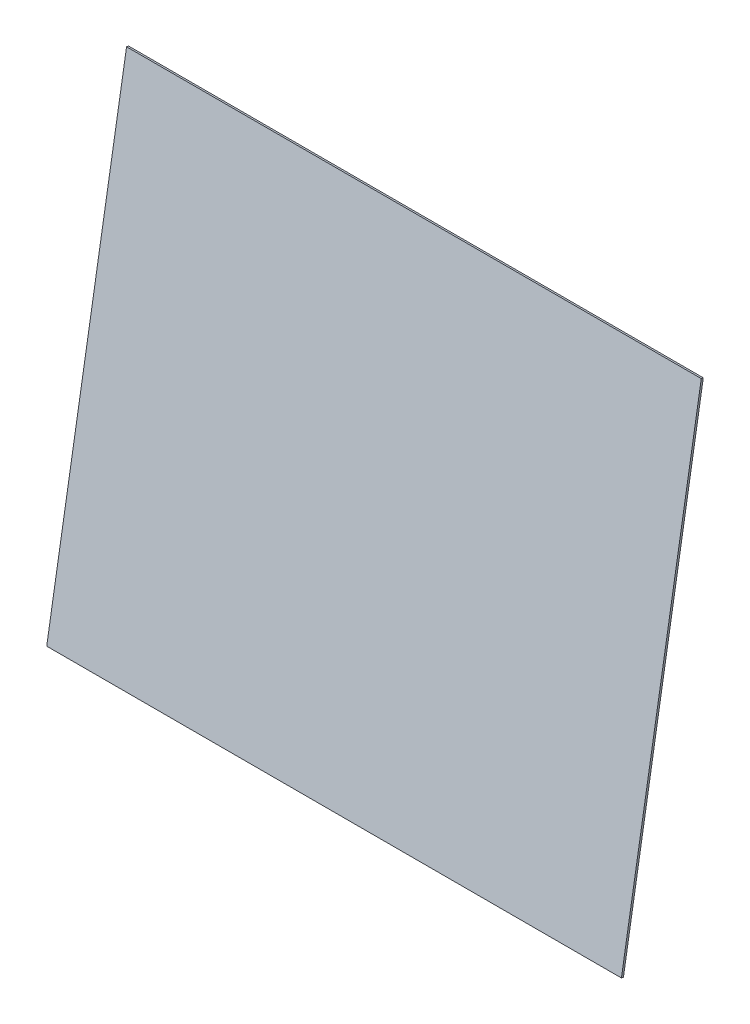
ISO-10303-21;
HEADER;
FILE_DESCRIPTION(('STEP AP214'),'2;1');
FILE_NAME('part.step','',(''),(''),'','','');
FILE_SCHEMA(('AUTOMOTIVE_DESIGN { 1 0 10303 214 1 1 1 1 }'));
ENDSEC;
DATA;
#1=APPLICATION_CONTEXT('core data for automotive mechanical design processes');
#2=APPLICATION_PROTOCOL_DEFINITION('international standard','automotive_design',2000,#1);
#3=PRODUCT_CONTEXT('',#1,'mechanical');
#4=PRODUCT('Part','Part','',(#3));
#5=PRODUCT_RELATED_PRODUCT_CATEGORY('part','',(#4));
#6=PRODUCT_DEFINITION_FORMATION('','',#4);
#7=PRODUCT_DEFINITION_CONTEXT('part definition',#1,'design');
#8=PRODUCT_DEFINITION('design','',#6,#7);
#9=PRODUCT_DEFINITION_SHAPE('','',#8);
#10=(LENGTH_UNIT() NAMED_UNIT(*) SI_UNIT(.MILLI.,.METRE.));
#11=(NAMED_UNIT(*) PLANE_ANGLE_UNIT() SI_UNIT($,.RADIAN.));
#12=(NAMED_UNIT(*) SI_UNIT($,.STERADIAN.) SOLID_ANGLE_UNIT());
#13=UNCERTAINTY_MEASURE_WITH_UNIT(LENGTH_MEASURE(1.E-05),#10,'distance_accuracy_value','');
#14=(GEOMETRIC_REPRESENTATION_CONTEXT(3) GLOBAL_UNCERTAINTY_ASSIGNED_CONTEXT((#13)) GLOBAL_UNIT_ASSIGNED_CONTEXT((#10,
#11,#12)) REPRESENTATION_CONTEXT('',''));
#15=CARTESIAN_POINT('',(0.,0.,0.));
#16=DIRECTION('',(0.,0.,1.));
#17=DIRECTION('',(1.,0.,0.));
#18=AXIS2_PLACEMENT_3D('',#15,#16,#17);
#19=CARTESIAN_POINT('',(922.5,1125.17058853381,1237.72213938073));
#20=DIRECTION('',(0.,0.986393923832144,-0.164398987305355));
#21=DIRECTION('',(0.,0.164398987305355,0.986393923832144));
#22=AXIS2_PLACEMENT_3D('',#19,#20,#21);
#23=PLANE('',#22);
#24=DIRECTION('',(1.,0.,0.));
#25=VECTOR('',#24,1.);
#26=CARTESIAN_POINT('',(922.5,1124.67739157189,1234.76295760924));
#27=LINE('',#26,#25);
#28=CARTESIAN_POINT('',(1762.5,1124.67739157189,1234.76295760924));
#29=VERTEX_POINT('',#28);
#30=CARTESIAN_POINT('',(922.5,1124.67739157189,1234.76295760924));
#31=VERTEX_POINT('',#30);
#32=EDGE_CURVE('E79',#29,#31,#27,.F.);
#33=ORIENTED_EDGE('',*,*,#32,.F.);
#34=DIRECTION('',(0.,-0.164398987305355,-0.986393923832144));
#35=VECTOR('',#34,1.);
#36=CARTESIAN_POINT('',(1762.5,1125.17058853381,1237.72213938073));
#37=LINE('',#36,#35);
#38=CARTESIAN_POINT('',(1762.5,1125.17058853381,1237.72213938073));
#39=VERTEX_POINT('',#38);
#40=EDGE_CURVE('E11',#29,#39,#37,.F.);
#41=ORIENTED_EDGE('',*,*,#40,.T.);
#42=DIRECTION('',(1.,0.,0.));
#43=VECTOR('',#42,1.);
#44=CARTESIAN_POINT('',(922.5,1125.17058853381,1237.72213938073));
#45=LINE('',#44,#43);
#46=CARTESIAN_POINT('',(922.5,1125.17058853381,1237.72213938073));
#47=VERTEX_POINT('',#46);
#48=EDGE_CURVE('E69',#39,#47,#45,.F.);
#49=ORIENTED_EDGE('',*,*,#48,.T.);
#50=DIRECTION('',(0.,-0.164398987305355,-0.986393923832144));
#51=VECTOR('',#50,1.);
#52=CARTESIAN_POINT('',(922.5,1125.17058853381,1237.72213938073));
#53=LINE('',#52,#51);
#54=EDGE_CURVE('E20',#31,#47,#53,.F.);
#55=ORIENTED_EDGE('',*,*,#54,.F.);
#56=EDGE_LOOP('',(#33,#41,#49,#55));
#57=FACE_BOUND('',#56,.T.);
#58=ADVANCED_FACE('F17',(#57),#23,.F.);
#59=CARTESIAN_POINT('',(1762.5,1125.17058853381,1237.72213938073));
#60=DIRECTION('',(-1.,0.,0.));
#61=DIRECTION('',(0.,0.,1.));
#62=AXIS2_PLACEMENT_3D('',#59,#60,#61);
#63=PLANE('',#62);
#64=DIRECTION('',(0.,0.986393923832144,-0.164398987305355));
#65=VECTOR('',#64,1.);
#66=CARTESIAN_POINT('',(1762.5,1124.67739157189,1234.76295760924));
#67=LINE('',#66,#65);
#68=CARTESIAN_POINT('',(1762.5,1825.01707749272,1118.03967662243));
#69=VERTEX_POINT('',#68);
#70=EDGE_CURVE('E51',#69,#29,#67,.F.);
#71=ORIENTED_EDGE('',*,*,#70,.F.);
#72=DIRECTION('',(0.,-0.164398987305355,-0.986393923832144));
#73=VECTOR('',#72,1.);
#74=CARTESIAN_POINT('',(1762.5,1825.51027445463,1120.99885839393));
#75=LINE('',#74,#73);
#76=CARTESIAN_POINT('',(1762.5,1825.51027445463,1120.99885839393));
#77=VERTEX_POINT('',#76);
#78=EDGE_CURVE('E27',#69,#77,#75,.F.);
#79=ORIENTED_EDGE('',*,*,#78,.T.);
#80=DIRECTION('',(0.,0.986393923832144,-0.164398987305355));
#81=VECTOR('',#80,1.);
#82=CARTESIAN_POINT('',(1762.5,1125.17058853381,1237.72213938073));
#83=LINE('',#82,#81);
#84=EDGE_CURVE('E65',#77,#39,#83,.F.);
#85=ORIENTED_EDGE('',*,*,#84,.T.);
#86=ORIENTED_EDGE('',*,*,#40,.F.);
#87=EDGE_LOOP('',(#71,#79,#85,#86));
#88=FACE_BOUND('',#87,.T.);
#89=ADVANCED_FACE('F66',(#88),#63,.F.);
#90=CARTESIAN_POINT('',(1762.5,1825.51027445463,1120.99885839393));
#91=DIRECTION('',(0.,-0.986393923832144,0.164398987305355));
#92=DIRECTION('',(0.,-0.164398987305355,-0.986393923832144));
#93=AXIS2_PLACEMENT_3D('',#90,#91,#92);
#94=PLANE('',#93);
#95=DIRECTION('',(-1.,0.,0.));
#96=VECTOR('',#95,1.);
#97=CARTESIAN_POINT('',(1762.5,1825.01707749272,1118.03967662243));
#98=LINE('',#97,#96);
#99=CARTESIAN_POINT('',(922.5,1825.01707749272,1118.03967662243));
#100=VERTEX_POINT('',#99);
#101=EDGE_CURVE('E57',#100,#69,#98,.F.);
#102=ORIENTED_EDGE('',*,*,#101,.F.);
#103=DIRECTION('',(0.,-0.164398987305355,-0.986393923832144));
#104=VECTOR('',#103,1.);
#105=CARTESIAN_POINT('',(922.5,1825.51027445463,1120.99885839393));
#106=LINE('',#105,#104);
#107=CARTESIAN_POINT('',(922.5,1825.51027445463,1120.99885839393));
#108=VERTEX_POINT('',#107);
#109=EDGE_CURVE('E96',#100,#108,#106,.F.);
#110=ORIENTED_EDGE('',*,*,#109,.T.);
#111=DIRECTION('',(-1.,0.,0.));
#112=VECTOR('',#111,1.);
#113=CARTESIAN_POINT('',(1762.5,1825.51027445463,1120.99885839393));
#114=LINE('',#113,#112);
#115=EDGE_CURVE('E35',#108,#77,#114,.F.);
#116=ORIENTED_EDGE('',*,*,#115,.T.);
#117=ORIENTED_EDGE('',*,*,#78,.F.);
#118=EDGE_LOOP('',(#102,#110,#116,#117));
#119=FACE_BOUND('',#118,.T.);
#120=ADVANCED_FACE('F112',(#119),#94,.F.);
#121=CARTESIAN_POINT('',(922.5,1825.51027445463,1120.99885839393));
#122=DIRECTION('',(1.,0.,0.));
#123=DIRECTION('',(0.,0.,-1.));
#124=AXIS2_PLACEMENT_3D('',#121,#122,#123);
#125=PLANE('',#124);
#126=DIRECTION('',(0.,-0.986393923832144,0.164398987305355));
#127=VECTOR('',#126,1.);
#128=CARTESIAN_POINT('',(922.5,1825.01707749272,1118.03967662243));
#129=LINE('',#128,#127);
#130=EDGE_CURVE('E76',#31,#100,#129,.F.);
#131=ORIENTED_EDGE('',*,*,#130,.F.);
#132=ORIENTED_EDGE('',*,*,#54,.T.);
#133=DIRECTION('',(0.,-0.986393923832144,0.164398987305355));
#134=VECTOR('',#133,1.);
#135=CARTESIAN_POINT('',(922.5,1825.51027445463,1120.99885839393));
#136=LINE('',#135,#134);
#137=EDGE_CURVE('E62',#47,#108,#136,.F.);
#138=ORIENTED_EDGE('',*,*,#137,.T.);
#139=ORIENTED_EDGE('',*,*,#109,.F.);
#140=EDGE_LOOP('',(#131,#132,#138,#139));
#141=FACE_BOUND('',#140,.T.);
#142=ADVANCED_FACE('F113',(#141),#125,.F.);
#143=CARTESIAN_POINT('',(7.32770328507797E-13,231.121714184272,1386.73028510565));
#144=DIRECTION('',(0.,0.164398987305355,0.986393923832144));
#145=DIRECTION('',(0.,-0.986393923832144,0.164398987305355));
#146=AXIS2_PLACEMENT_3D('',#143,#144,#145);
#147=PLANE('',#146);
#148=ORIENTED_EDGE('',*,*,#48,.F.);
#149=ORIENTED_EDGE('',*,*,#84,.F.);
#150=ORIENTED_EDGE('',*,*,#115,.F.);
#151=ORIENTED_EDGE('',*,*,#137,.F.);
#152=EDGE_LOOP('',(#148,#149,#150,#151));
#153=FACE_BOUND('',#152,.T.);
#154=ADVANCED_FACE('F72',(#153),#147,.T.);
#155=CARTESIAN_POINT('',(7.30842922155561E-13,230.628517222356,1383.77110333416));
#156=DIRECTION('',(0.,0.164398987305355,0.986393923832144));
#157=DIRECTION('',(0.,-0.986393923832144,0.164398987305355));
#158=AXIS2_PLACEMENT_3D('',#155,#156,#157);
#159=PLANE('',#158);
#160=ORIENTED_EDGE('',*,*,#32,.T.);
#161=ORIENTED_EDGE('',*,*,#130,.T.);
#162=ORIENTED_EDGE('',*,*,#101,.T.);
#163=ORIENTED_EDGE('',*,*,#70,.T.);
#164=EDGE_LOOP('',(#160,#161,#162,#163));
#165=FACE_BOUND('',#164,.T.);
#166=ADVANCED_FACE('F114',(#165),#159,.F.);
#167=CLOSED_SHELL('',(#58,#89,#120,#142,#154,#166));
#168=MANIFOLD_SOLID_BREP('B1',#167);
#169=ADVANCED_BREP_SHAPE_REPRESENTATION('',(#18,#168),#14);
#170=SHAPE_DEFINITION_REPRESENTATION(#9,#169);
ENDSEC;
END-ISO-10303-21;
